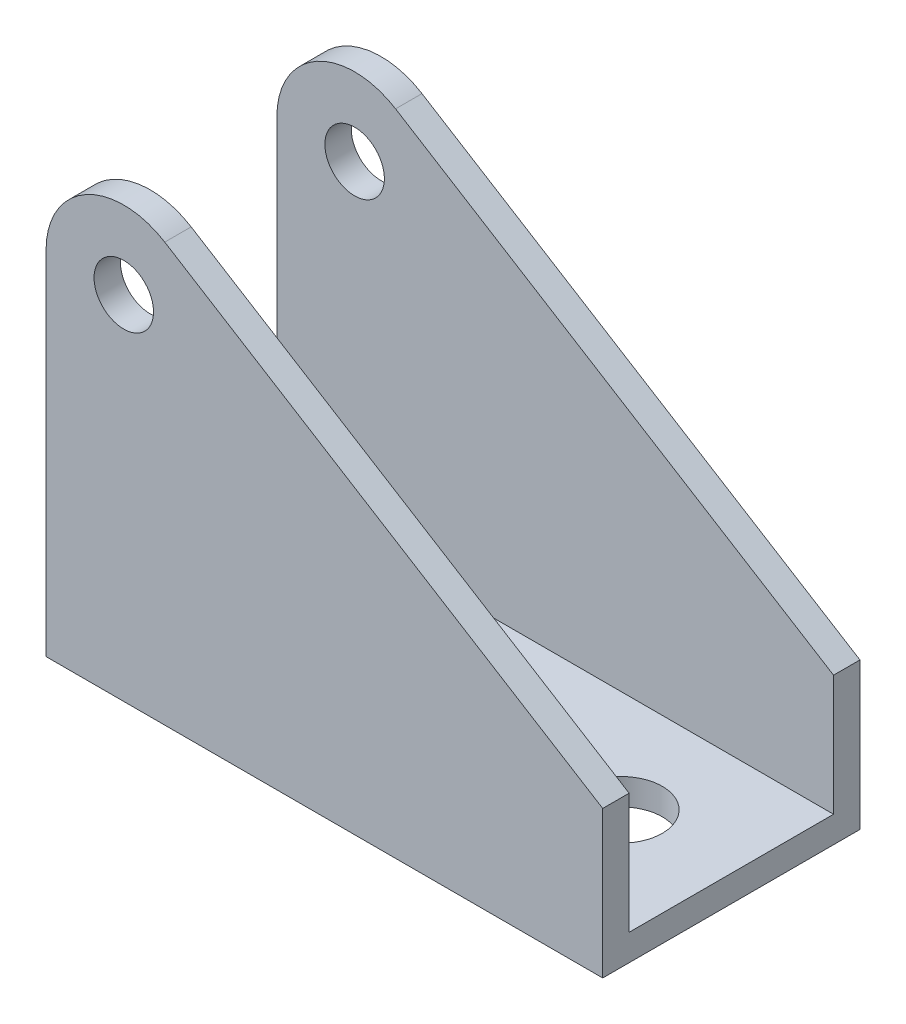
ISO-10303-21;
HEADER;
FILE_DESCRIPTION(('STEP AP214'),'2;1');
FILE_NAME('part.step','',(''),(''),'','','');
FILE_SCHEMA(('AUTOMOTIVE_DESIGN { 1 0 10303 214 1 1 1 1 }'));
ENDSEC;
DATA;
#1=APPLICATION_CONTEXT('core data for automotive mechanical design processes');
#2=APPLICATION_PROTOCOL_DEFINITION('international standard','automotive_design',2000,#1);
#3=PRODUCT_CONTEXT('',#1,'mechanical');
#4=PRODUCT('Part','Part','',(#3));
#5=PRODUCT_RELATED_PRODUCT_CATEGORY('part','',(#4));
#6=PRODUCT_DEFINITION_FORMATION('','',#4);
#7=PRODUCT_DEFINITION_CONTEXT('part definition',#1,'design');
#8=PRODUCT_DEFINITION('design','',#6,#7);
#9=PRODUCT_DEFINITION_SHAPE('','',#8);
#10=(LENGTH_UNIT() NAMED_UNIT(*) SI_UNIT(.MILLI.,.METRE.));
#11=(NAMED_UNIT(*) PLANE_ANGLE_UNIT() SI_UNIT($,.RADIAN.));
#12=(NAMED_UNIT(*) SI_UNIT($,.STERADIAN.) SOLID_ANGLE_UNIT());
#13=UNCERTAINTY_MEASURE_WITH_UNIT(LENGTH_MEASURE(1.E-05),#10,'distance_accuracy_value','');
#14=(GEOMETRIC_REPRESENTATION_CONTEXT(3) GLOBAL_UNCERTAINTY_ASSIGNED_CONTEXT((#13)) GLOBAL_UNIT_ASSIGNED_CONTEXT((#10,
#11,#12)) REPRESENTATION_CONTEXT('',''));
#15=CARTESIAN_POINT('',(0.,0.,0.));
#16=DIRECTION('',(0.,0.,1.));
#17=DIRECTION('',(1.,0.,0.));
#18=AXIS2_PLACEMENT_3D('',#15,#16,#17);
#19=CARTESIAN_POINT('',(0.,2.75,0.));
#20=DIRECTION('',(0.,1.,0.));
#21=DIRECTION('',(0.,0.,1.));
#22=AXIS2_PLACEMENT_3D('',#19,#20,#21);
#23=PLANE('',#22);
#24=CARTESIAN_POINT('',(0.,2.75,0.));
#25=DIRECTION('',(0.,1.,0.));
#26=DIRECTION('',(0.,0.,1.));
#27=AXIS2_PLACEMENT_3D('',#24,#25,#26);
#28=CIRCLE('',#27,4.25);
#29=CARTESIAN_POINT('',(0.,2.75,4.25));
#30=VERTEX_POINT('',#29);
#31=EDGE_CURVE('E226',#30,#30,#28,.T.);
#32=ORIENTED_EDGE('',*,*,#31,.F.);
#33=EDGE_LOOP('',(#32));
#34=FACE_BOUND('',#33,.T.);
#35=DIRECTION('',(0.,0.,-1.));
#36=VECTOR('',#35,1.);
#37=CARTESIAN_POINT('',(11.45,2.75,0.));
#38=LINE('',#37,#36);
#39=CARTESIAN_POINT('',(11.45,2.75,10.65));
#40=VERTEX_POINT('',#39);
#41=CARTESIAN_POINT('',(11.45,2.75,-10.65));
#42=VERTEX_POINT('',#41);
#43=EDGE_CURVE('E221',#40,#42,#38,.T.);
#44=ORIENTED_EDGE('',*,*,#43,.T.);
#45=DIRECTION('',(-1.,0.,0.));
#46=VECTOR('',#45,1.);
#47=CARTESIAN_POINT('',(0.,2.75,-10.65));
#48=LINE('',#47,#46);
#49=CARTESIAN_POINT('',(-46.55,2.75,-10.65));
#50=VERTEX_POINT('',#49);
#51=EDGE_CURVE('E179',#42,#50,#48,.T.);
#52=ORIENTED_EDGE('',*,*,#51,.T.);
#53=DIRECTION('',(0.,0.,-1.));
#54=VECTOR('',#53,1.);
#55=CARTESIAN_POINT('',(-46.55,2.75,0.));
#56=LINE('',#55,#54);
#57=CARTESIAN_POINT('',(-46.55,2.75,-4.25000000000001));
#58=VERTEX_POINT('',#57);
#59=EDGE_CURVE('E145',#58,#50,#56,.T.);
#60=ORIENTED_EDGE('',*,*,#59,.F.);
#61=DIRECTION('',(-1.,0.,0.));
#62=VECTOR('',#61,1.);
#63=CARTESIAN_POINT('',(0.,2.75,-4.25000000000001));
#64=LINE('',#63,#62);
#65=CARTESIAN_POINT('',(-36.5,2.75,-4.25000000000001));
#66=VERTEX_POINT('',#65);
#67=EDGE_CURVE('E224',#66,#58,#64,.T.);
#68=ORIENTED_EDGE('',*,*,#67,.F.);
#69=CARTESIAN_POINT('',(-36.5,2.75,0.));
#70=DIRECTION('',(0.,1.,0.));
#71=DIRECTION('',(0.,0.,1.));
#72=AXIS2_PLACEMENT_3D('',#69,#70,#71);
#73=CIRCLE('',#72,4.25000000000001);
#74=CARTESIAN_POINT('',(-36.5,2.75,4.25000000000001));
#75=VERTEX_POINT('',#74);
#76=EDGE_CURVE('E213',#75,#66,#73,.T.);
#77=ORIENTED_EDGE('',*,*,#76,.F.);
#78=DIRECTION('',(-1.,0.,0.));
#79=VECTOR('',#78,1.);
#80=CARTESIAN_POINT('',(0.,2.75,4.25000000000001));
#81=LINE('',#80,#79);
#82=CARTESIAN_POINT('',(-46.55,2.75,4.25000000000001));
#83=VERTEX_POINT('',#82);
#84=EDGE_CURVE('E215',#75,#83,#81,.T.);
#85=ORIENTED_EDGE('',*,*,#84,.T.);
#86=CARTESIAN_POINT('',(-46.55,2.75,10.65));
#87=VERTEX_POINT('',#86);
#88=EDGE_CURVE('E219',#87,#83,#56,.T.);
#89=ORIENTED_EDGE('',*,*,#88,.F.);
#90=DIRECTION('',(-1.,0.,0.));
#91=VECTOR('',#90,1.);
#92=CARTESIAN_POINT('',(0.,2.75,10.65));
#93=LINE('',#92,#91);
#94=EDGE_CURVE('E206',#40,#87,#93,.T.);
#95=ORIENTED_EDGE('',*,*,#94,.F.);
#96=EDGE_LOOP('',(#44,#52,#60,#68,#77,#85,#89,#95));
#97=FACE_BOUND('',#96,.T.);
#98=ADVANCED_FACE('F33',(#34,#97),#23,.T.);
#99=CARTESIAN_POINT('',(-36.5,2.75,0.));
#100=DIRECTION('',(0.,-1.,0.));
#101=DIRECTION('',(0.,0.,-1.));
#102=AXIS2_PLACEMENT_3D('',#99,#100,#101);
#103=CYLINDRICAL_SURFACE('',#102,4.25000000000001);
#104=CARTESIAN_POINT('',(-36.5,0.,0.));
#105=DIRECTION('',(0.,1.,0.));
#106=DIRECTION('',(0.,0.,1.));
#107=AXIS2_PLACEMENT_3D('',#104,#105,#106);
#108=CIRCLE('',#107,4.25000000000001);
#109=CARTESIAN_POINT('',(-36.5,0.,4.25000000000001));
#110=VERTEX_POINT('',#109);
#111=CARTESIAN_POINT('',(-36.5,0.,-4.25000000000001));
#112=VERTEX_POINT('',#111);
#113=EDGE_CURVE('E212',#110,#112,#108,.T.);
#114=ORIENTED_EDGE('',*,*,#113,.F.);
#115=DIRECTION('',(0.,-1.,0.));
#116=VECTOR('',#115,1.);
#117=CARTESIAN_POINT('',(-36.5,2.75,4.25000000000001));
#118=LINE('',#117,#116);
#119=EDGE_CURVE('E11',#75,#110,#118,.T.);
#120=ORIENTED_EDGE('',*,*,#119,.F.);
#121=ORIENTED_EDGE('',*,*,#76,.T.);
#122=DIRECTION('',(0.,-1.,0.));
#123=VECTOR('',#122,1.);
#124=CARTESIAN_POINT('',(-36.5,2.75,-4.25000000000001));
#125=LINE('',#124,#123);
#126=EDGE_CURVE('E57',#66,#112,#125,.T.);
#127=ORIENTED_EDGE('',*,*,#126,.T.);
#128=EDGE_LOOP('',(#114,#120,#121,#127));
#129=FACE_BOUND('',#128,.T.);
#130=ADVANCED_FACE('F35',(#129),#103,.F.);
#131=CARTESIAN_POINT('',(0.,2.75,4.25000000000001));
#132=DIRECTION('',(0.,0.,1.));
#133=DIRECTION('',(1.,0.,0.));
#134=AXIS2_PLACEMENT_3D('',#131,#132,#133);
#135=PLANE('',#134);
#136=DIRECTION('',(-1.,0.,0.));
#137=VECTOR('',#136,1.);
#138=CARTESIAN_POINT('',(0.,0.,4.25000000000001));
#139=LINE('',#138,#137);
#140=CARTESIAN_POINT('',(-46.55,0.,4.25000000000001));
#141=VERTEX_POINT('',#140);
#142=EDGE_CURVE('E230',#110,#141,#139,.T.);
#143=ORIENTED_EDGE('',*,*,#142,.T.);
#144=DIRECTION('',(0.,-1.,0.));
#145=VECTOR('',#144,1.);
#146=CARTESIAN_POINT('',(-46.55,2.75,4.25000000000001));
#147=LINE('',#146,#145);
#148=EDGE_CURVE('E41',#83,#141,#147,.T.);
#149=ORIENTED_EDGE('',*,*,#148,.F.);
#150=ORIENTED_EDGE('',*,*,#84,.F.);
#151=ORIENTED_EDGE('',*,*,#119,.T.);
#152=EDGE_LOOP('',(#143,#149,#150,#151));
#153=FACE_BOUND('',#152,.T.);
#154=ADVANCED_FACE('F267',(#153),#135,.F.);
#155=CARTESIAN_POINT('',(-46.55,2.75,0.));
#156=DIRECTION('',(-1.,0.,0.));
#157=DIRECTION('',(0.,0.,1.));
#158=AXIS2_PLACEMENT_3D('',#155,#156,#157);
#159=PLANE('',#158);
#160=ORIENTED_EDGE('',*,*,#148,.T.);
#161=DIRECTION('',(0.,0.,-1.));
#162=VECTOR('',#161,1.);
#163=CARTESIAN_POINT('',(-46.55,0.,0.));
#164=LINE('',#163,#162);
#165=CARTESIAN_POINT('',(-46.55,0.,13.4));
#166=VERTEX_POINT('',#165);
#167=EDGE_CURVE('E233',#166,#141,#164,.T.);
#168=ORIENTED_EDGE('',*,*,#167,.F.);
#169=DIRECTION('',(0.,-1.,0.));
#170=VECTOR('',#169,1.);
#171=CARTESIAN_POINT('',(-46.55,2.75,13.4));
#172=LINE('',#171,#170);
#173=CARTESIAN_POINT('',(-46.55,36.7,13.4));
#174=VERTEX_POINT('',#173);
#175=EDGE_CURVE('E259',#174,#166,#172,.T.);
#176=ORIENTED_EDGE('',*,*,#175,.F.);
#177=DIRECTION('',(0.,0.,1.));
#178=VECTOR('',#177,1.);
#179=CARTESIAN_POINT('',(-46.55,36.7,10.65));
#180=LINE('',#179,#178);
#181=CARTESIAN_POINT('',(-46.55,36.7,10.65));
#182=VERTEX_POINT('',#181);
#183=EDGE_CURVE('E207',#182,#174,#180,.T.);
#184=ORIENTED_EDGE('',*,*,#183,.F.);
#185=DIRECTION('',(0.,-1.,0.));
#186=VECTOR('',#185,1.);
#187=CARTESIAN_POINT('',(-46.55,2.75000000000001,10.65));
#188=LINE('',#187,#186);
#189=EDGE_CURVE('E48',#182,#87,#188,.T.);
#190=ORIENTED_EDGE('',*,*,#189,.T.);
#191=ORIENTED_EDGE('',*,*,#88,.T.);
#192=EDGE_LOOP('',(#160,#168,#176,#184,#190,#191));
#193=FACE_BOUND('',#192,.T.);
#194=ADVANCED_FACE('F263',(#193),#159,.T.);
#195=CARTESIAN_POINT('',(0.,2.75,13.4));
#196=DIRECTION('',(0.,0.,-1.));
#197=DIRECTION('',(-1.,0.,0.));
#198=AXIS2_PLACEMENT_3D('',#195,#196,#197);
#199=PLANE('',#198);
#200=DIRECTION('',(1.,0.,0.));
#201=VECTOR('',#200,1.);
#202=CARTESIAN_POINT('',(0.,0.,13.4));
#203=LINE('',#202,#201);
#204=CARTESIAN_POINT('',(11.45,0.,13.4));
#205=VERTEX_POINT('',#204);
#206=EDGE_CURVE('E235',#166,#205,#203,.T.);
#207=ORIENTED_EDGE('',*,*,#206,.T.);
#208=DIRECTION('',(0.,-1.,0.));
#209=VECTOR('',#208,1.);
#210=CARTESIAN_POINT('',(11.45,2.75,13.4));
#211=LINE('',#210,#209);
#212=CARTESIAN_POINT('',(11.45,15.3,13.4));
#213=VERTEX_POINT('',#212);
#214=EDGE_CURVE('E256',#213,#205,#211,.T.);
#215=ORIENTED_EDGE('',*,*,#214,.F.);
#216=DIRECTION('',(-0.849965225718267,0.52683879419581,0.));
#217=VECTOR('',#216,1.);
#218=CARTESIAN_POINT('',(8.79787478310156,16.9438819013405,13.4));
#219=LINE('',#218,#217);
#220=CARTESIAN_POINT('',(-34.182605767014,43.584718328318,13.4));
#221=VERTEX_POINT('',#220);
#222=EDGE_CURVE('E186',#213,#221,#219,.T.);
#223=ORIENTED_EDGE('',*,*,#222,.T.);
#224=CARTESIAN_POINT('',(-38.45,36.7,13.4));
#225=DIRECTION('',(0.,0.,-1.));
#226=DIRECTION('',(-1.,0.,0.));
#227=AXIS2_PLACEMENT_3D('',#224,#225,#226);
#228=CIRCLE('',#227,8.1);
#229=EDGE_CURVE('E193',#174,#221,#228,.T.);
#230=ORIENTED_EDGE('',*,*,#229,.F.);
#231=ORIENTED_EDGE('',*,*,#175,.T.);
#232=EDGE_LOOP('',(#207,#215,#223,#230,#231));
#233=FACE_BOUND('',#232,.T.);
#234=CARTESIAN_POINT('',(-38.45,36.7,13.4));
#235=DIRECTION('',(0.,0.,-1.));
#236=DIRECTION('',(-1.,0.,0.));
#237=AXIS2_PLACEMENT_3D('',#234,#235,#236);
#238=CIRCLE('',#237,3.09999999999999);
#239=CARTESIAN_POINT('',(-41.55,36.7,13.4));
#240=VERTEX_POINT('',#239);
#241=EDGE_CURVE('E182',#240,#240,#238,.T.);
#242=ORIENTED_EDGE('',*,*,#241,.T.);
#243=EDGE_LOOP('',(#242));
#244=FACE_BOUND('',#243,.T.);
#245=ADVANCED_FACE('F306',(#233,#244),#199,.F.);
#246=CARTESIAN_POINT('',(11.45,2.75,0.));
#247=DIRECTION('',(-1.,0.,0.));
#248=DIRECTION('',(0.,0.,1.));
#249=AXIS2_PLACEMENT_3D('',#246,#247,#248);
#250=PLANE('',#249);
#251=DIRECTION('',(0.,-1.,0.));
#252=VECTOR('',#251,1.);
#253=CARTESIAN_POINT('',(11.45,2.75,-13.4));
#254=LINE('',#253,#252);
#255=CARTESIAN_POINT('',(11.45,15.3,-13.4));
#256=VERTEX_POINT('',#255);
#257=CARTESIAN_POINT('',(11.45,0.,-13.4));
#258=VERTEX_POINT('',#257);
#259=EDGE_CURVE('E253',#256,#258,#254,.T.);
#260=ORIENTED_EDGE('',*,*,#259,.F.);
#261=DIRECTION('',(0.,0.,-1.));
#262=VECTOR('',#261,1.);
#263=CARTESIAN_POINT('',(11.45,15.3,-10.65));
#264=LINE('',#263,#262);
#265=CARTESIAN_POINT('',(11.45,15.3,-10.65));
#266=VERTEX_POINT('',#265);
#267=EDGE_CURVE('E176',#266,#256,#264,.T.);
#268=ORIENTED_EDGE('',*,*,#267,.F.);
#269=DIRECTION('',(0.,-1.,0.));
#270=VECTOR('',#269,1.);
#271=CARTESIAN_POINT('',(11.45,2.75,-10.65));
#272=LINE('',#271,#270);
#273=EDGE_CURVE('E158',#266,#42,#272,.T.);
#274=ORIENTED_EDGE('',*,*,#273,.T.);
#275=ORIENTED_EDGE('',*,*,#43,.F.);
#276=DIRECTION('',(0.,1.,0.));
#277=VECTOR('',#276,1.);
#278=CARTESIAN_POINT('',(11.45,2.75,10.65));
#279=LINE('',#278,#277);
#280=CARTESIAN_POINT('',(11.45,15.3,10.65));
#281=VERTEX_POINT('',#280);
#282=EDGE_CURVE('E196',#40,#281,#279,.T.);
#283=ORIENTED_EDGE('',*,*,#282,.T.);
#284=DIRECTION('',(0.,0.,1.));
#285=VECTOR('',#284,1.);
#286=CARTESIAN_POINT('',(11.45,15.3,10.65));
#287=LINE('',#286,#285);
#288=EDGE_CURVE('E203',#281,#213,#287,.T.);
#289=ORIENTED_EDGE('',*,*,#288,.T.);
#290=ORIENTED_EDGE('',*,*,#214,.T.);
#291=DIRECTION('',(0.,0.,-1.));
#292=VECTOR('',#291,1.);
#293=CARTESIAN_POINT('',(11.45,0.,0.));
#294=LINE('',#293,#292);
#295=EDGE_CURVE('E238',#205,#258,#294,.T.);
#296=ORIENTED_EDGE('',*,*,#295,.T.);
#297=EDGE_LOOP('',(#260,#268,#274,#275,#283,#289,#290,#296));
#298=FACE_BOUND('',#297,.T.);
#299=ADVANCED_FACE('F302',(#298),#250,.F.);
#300=CARTESIAN_POINT('',(0.,2.75,-13.4));
#301=DIRECTION('',(0.,0.,-1.));
#302=DIRECTION('',(-1.,0.,0.));
#303=AXIS2_PLACEMENT_3D('',#300,#301,#302);
#304=PLANE('',#303);
#305=DIRECTION('',(1.,0.,0.));
#306=VECTOR('',#305,1.);
#307=CARTESIAN_POINT('',(0.,0.,-13.4));
#308=LINE('',#307,#306);
#309=CARTESIAN_POINT('',(-46.55,0.,-13.4));
#310=VERTEX_POINT('',#309);
#311=EDGE_CURVE('E240',#310,#258,#308,.T.);
#312=ORIENTED_EDGE('',*,*,#311,.F.);
#313=DIRECTION('',(0.,-1.,0.));
#314=VECTOR('',#313,1.);
#315=CARTESIAN_POINT('',(-46.55,2.75,-13.4));
#316=LINE('',#315,#314);
#317=CARTESIAN_POINT('',(-46.55,36.7,-13.4));
#318=VERTEX_POINT('',#317);
#319=EDGE_CURVE('E251',#318,#310,#316,.T.);
#320=ORIENTED_EDGE('',*,*,#319,.F.);
#321=CARTESIAN_POINT('',(-38.45,36.7,-13.4));
#322=DIRECTION('',(0.,0.,-1.));
#323=DIRECTION('',(-1.,0.,0.));
#324=AXIS2_PLACEMENT_3D('',#321,#322,#323);
#325=CIRCLE('',#324,8.1);
#326=CARTESIAN_POINT('',(-34.1826057670139,43.584718328318,-13.4));
#327=VERTEX_POINT('',#326);
#328=EDGE_CURVE('E156',#318,#327,#325,.T.);
#329=ORIENTED_EDGE('',*,*,#328,.T.);
#330=DIRECTION('',(0.849965225718267,-0.52683879419581,0.));
#331=VECTOR('',#330,1.);
#332=CARTESIAN_POINT('',(8.79787478310156,16.9438819013405,-13.4));
#333=LINE('',#332,#331);
#334=EDGE_CURVE('E150',#327,#256,#333,.T.);
#335=ORIENTED_EDGE('',*,*,#334,.T.);
#336=ORIENTED_EDGE('',*,*,#259,.T.);
#337=EDGE_LOOP('',(#312,#320,#329,#335,#336));
#338=FACE_BOUND('',#337,.T.);
#339=CARTESIAN_POINT('',(-38.45,36.7,-13.4));
#340=DIRECTION('',(0.,0.,-1.));
#341=DIRECTION('',(-1.,0.,0.));
#342=AXIS2_PLACEMENT_3D('',#339,#340,#341);
#343=CIRCLE('',#342,3.09999999999999);
#344=CARTESIAN_POINT('',(-41.55,36.7,-13.4));
#345=VERTEX_POINT('',#344);
#346=EDGE_CURVE('E356',#345,#345,#343,.T.);
#347=ORIENTED_EDGE('',*,*,#346,.F.);
#348=EDGE_LOOP('',(#347));
#349=FACE_BOUND('',#348,.T.);
#350=ADVANCED_FACE('F299',(#338,#349),#304,.T.);
#351=ORIENTED_EDGE('',*,*,#319,.T.);
#352=CARTESIAN_POINT('',(-46.55,0.,-4.25000000000001));
#353=VERTEX_POINT('',#352);
#354=EDGE_CURVE('E236',#353,#310,#164,.T.);
#355=ORIENTED_EDGE('',*,*,#354,.F.);
#356=DIRECTION('',(0.,-1.,0.));
#357=VECTOR('',#356,1.);
#358=CARTESIAN_POINT('',(-46.55,2.75,-4.25000000000001));
#359=LINE('',#358,#357);
#360=EDGE_CURVE('E249',#58,#353,#359,.T.);
#361=ORIENTED_EDGE('',*,*,#360,.F.);
#362=ORIENTED_EDGE('',*,*,#59,.T.);
#363=DIRECTION('',(0.,1.,0.));
#364=VECTOR('',#363,1.);
#365=CARTESIAN_POINT('',(-46.55,2.75000000000001,-10.65));
#366=LINE('',#365,#364);
#367=CARTESIAN_POINT('',(-46.55,36.7,-10.65));
#368=VERTEX_POINT('',#367);
#369=EDGE_CURVE('E138',#50,#368,#366,.T.);
#370=ORIENTED_EDGE('',*,*,#369,.T.);
#371=DIRECTION('',(0.,0.,-1.));
#372=VECTOR('',#371,1.);
#373=CARTESIAN_POINT('',(-46.55,36.7,-10.65));
#374=LINE('',#373,#372);
#375=EDGE_CURVE('E142',#368,#318,#374,.T.);
#376=ORIENTED_EDGE('',*,*,#375,.T.);
#377=EDGE_LOOP('',(#351,#355,#361,#362,#370,#376));
#378=FACE_BOUND('',#377,.T.);
#379=ADVANCED_FACE('F141',(#378),#159,.T.);
#380=CARTESIAN_POINT('',(0.,2.75,-4.25000000000001));
#381=DIRECTION('',(0.,0.,1.));
#382=DIRECTION('',(1.,0.,0.));
#383=AXIS2_PLACEMENT_3D('',#380,#381,#382);
#384=PLANE('',#383);
#385=DIRECTION('',(-1.,0.,0.));
#386=VECTOR('',#385,1.);
#387=CARTESIAN_POINT('',(0.,0.,-4.25000000000001));
#388=LINE('',#387,#386);
#389=EDGE_CURVE('E243',#112,#353,#388,.T.);
#390=ORIENTED_EDGE('',*,*,#389,.F.);
#391=ORIENTED_EDGE('',*,*,#126,.F.);
#392=ORIENTED_EDGE('',*,*,#67,.T.);
#393=ORIENTED_EDGE('',*,*,#360,.T.);
#394=EDGE_LOOP('',(#390,#391,#392,#393));
#395=FACE_BOUND('',#394,.T.);
#396=ADVANCED_FACE('F293',(#395),#384,.T.);
#397=CARTESIAN_POINT('',(0.,2.75,0.));
#398=DIRECTION('',(0.,-1.,0.));
#399=DIRECTION('',(0.,0.,-1.));
#400=AXIS2_PLACEMENT_3D('',#397,#398,#399);
#401=CYLINDRICAL_SURFACE('',#400,4.25);
#402=ORIENTED_EDGE('',*,*,#31,.T.);
#403=EDGE_LOOP('',(#402));
#404=FACE_BOUND('',#403,.T.);
#405=CARTESIAN_POINT('',(0.,0.,0.));
#406=DIRECTION('',(0.,1.,0.));
#407=DIRECTION('',(0.,0.,1.));
#408=AXIS2_PLACEMENT_3D('',#405,#406,#407);
#409=CIRCLE('',#408,4.25);
#410=CARTESIAN_POINT('',(0.,0.,4.25));
#411=VERTEX_POINT('',#410);
#412=EDGE_CURVE('E216',#411,#411,#409,.T.);
#413=ORIENTED_EDGE('',*,*,#412,.F.);
#414=EDGE_LOOP('',(#413));
#415=FACE_BOUND('',#414,.T.);
#416=ADVANCED_FACE('F290',(#404,#415),#401,.F.);
#417=CARTESIAN_POINT('',(0.,0.,0.));
#418=DIRECTION('',(0.,1.,0.));
#419=DIRECTION('',(0.,0.,1.));
#420=AXIS2_PLACEMENT_3D('',#417,#418,#419);
#421=PLANE('',#420);
#422=ORIENTED_EDGE('',*,*,#311,.T.);
#423=ORIENTED_EDGE('',*,*,#295,.F.);
#424=ORIENTED_EDGE('',*,*,#206,.F.);
#425=ORIENTED_EDGE('',*,*,#167,.T.);
#426=ORIENTED_EDGE('',*,*,#142,.F.);
#427=ORIENTED_EDGE('',*,*,#113,.T.);
#428=ORIENTED_EDGE('',*,*,#389,.T.);
#429=ORIENTED_EDGE('',*,*,#354,.T.);
#430=EDGE_LOOP('',(#422,#423,#424,#425,#426,#427,#428,#429));
#431=FACE_BOUND('',#430,.T.);
#432=ORIENTED_EDGE('',*,*,#412,.T.);
#433=EDGE_LOOP('',(#432));
#434=FACE_BOUND('',#433,.T.);
#435=ADVANCED_FACE('F269',(#431,#434),#421,.F.);
#436=CARTESIAN_POINT('',(-38.45,36.7,10.65));
#437=DIRECTION('',(0.,0.,-1.));
#438=DIRECTION('',(-1.,0.,0.));
#439=AXIS2_PLACEMENT_3D('',#436,#437,#438);
#440=PLANE('',#439);
#441=ORIENTED_EDGE('',*,*,#282,.F.);
#442=ORIENTED_EDGE('',*,*,#94,.T.);
#443=ORIENTED_EDGE('',*,*,#189,.F.);
#444=CARTESIAN_POINT('',(-38.45,36.7,10.65));
#445=DIRECTION('',(0.,0.,-1.));
#446=DIRECTION('',(-1.,0.,0.));
#447=AXIS2_PLACEMENT_3D('',#444,#445,#446);
#448=CIRCLE('',#447,8.1);
#449=CARTESIAN_POINT('',(-34.182605767014,43.584718328318,10.65));
#450=VERTEX_POINT('',#449);
#451=EDGE_CURVE('E192',#182,#450,#448,.T.);
#452=ORIENTED_EDGE('',*,*,#451,.T.);
#453=DIRECTION('',(-0.849965225718267,0.52683879419581,0.));
#454=VECTOR('',#453,1.);
#455=CARTESIAN_POINT('',(8.79787478310156,16.9438819013405,10.65));
#456=LINE('',#455,#454);
#457=EDGE_CURVE('E189',#281,#450,#456,.T.);
#458=ORIENTED_EDGE('',*,*,#457,.F.);
#459=EDGE_LOOP('',(#441,#442,#443,#452,#458));
#460=FACE_BOUND('',#459,.T.);
#461=CARTESIAN_POINT('',(-38.45,36.7,10.65));
#462=DIRECTION('',(0.,0.,-1.));
#463=DIRECTION('',(-1.,0.,0.));
#464=AXIS2_PLACEMENT_3D('',#461,#462,#463);
#465=CIRCLE('',#464,3.09999999999999);
#466=CARTESIAN_POINT('',(-41.55,36.7,10.65));
#467=VERTEX_POINT('',#466);
#468=EDGE_CURVE('E183',#467,#467,#465,.T.);
#469=ORIENTED_EDGE('',*,*,#468,.F.);
#470=EDGE_LOOP('',(#469));
#471=FACE_BOUND('',#470,.T.);
#472=ADVANCED_FACE('F289',(#460,#471),#440,.T.);
#473=CARTESIAN_POINT('',(8.79787478310156,16.9438819013405,10.65));
#474=DIRECTION('',(0.52683879419581,0.849965225718267,0.));
#475=DIRECTION('',(-0.849965225718267,0.52683879419581,0.));
#476=AXIS2_PLACEMENT_3D('',#473,#474,#475);
#477=PLANE('',#476);
#478=ORIENTED_EDGE('',*,*,#222,.F.);
#479=ORIENTED_EDGE('',*,*,#288,.F.);
#480=ORIENTED_EDGE('',*,*,#457,.T.);
#481=DIRECTION('',(0.,0.,1.));
#482=VECTOR('',#481,1.);
#483=CARTESIAN_POINT('',(-34.182605767014,43.584718328318,10.65));
#484=LINE('',#483,#482);
#485=EDGE_CURVE('E198',#450,#221,#484,.T.);
#486=ORIENTED_EDGE('',*,*,#485,.T.);
#487=EDGE_LOOP('',(#478,#479,#480,#486));
#488=FACE_BOUND('',#487,.T.);
#489=ADVANCED_FACE('F285',(#488),#477,.T.);
#490=CARTESIAN_POINT('',(-38.45,36.7,10.65));
#491=DIRECTION('',(0.,0.,1.));
#492=DIRECTION('',(1.,0.,0.));
#493=AXIS2_PLACEMENT_3D('',#490,#491,#492);
#494=CYLINDRICAL_SURFACE('',#493,8.1);
#495=ORIENTED_EDGE('',*,*,#229,.T.);
#496=ORIENTED_EDGE('',*,*,#485,.F.);
#497=ORIENTED_EDGE('',*,*,#451,.F.);
#498=ORIENTED_EDGE('',*,*,#183,.T.);
#499=EDGE_LOOP('',(#495,#496,#497,#498));
#500=FACE_BOUND('',#499,.T.);
#501=ADVANCED_FACE('F319',(#500),#494,.T.);
#502=CARTESIAN_POINT('',(-38.45,36.7,10.65));
#503=DIRECTION('',(0.,0.,1.));
#504=DIRECTION('',(1.,0.,0.));
#505=AXIS2_PLACEMENT_3D('',#502,#503,#504);
#506=CYLINDRICAL_SURFACE('',#505,3.09999999999999);
#507=ORIENTED_EDGE('',*,*,#468,.T.);
#508=EDGE_LOOP('',(#507));
#509=FACE_BOUND('',#508,.T.);
#510=ORIENTED_EDGE('',*,*,#241,.F.);
#511=EDGE_LOOP('',(#510));
#512=FACE_BOUND('',#511,.T.);
#513=ADVANCED_FACE('F316',(#509,#512),#506,.F.);
#514=CARTESIAN_POINT('',(8.79787478310156,16.9438819013405,-10.65));
#515=DIRECTION('',(0.52683879419581,0.849965225718267,0.));
#516=DIRECTION('',(-0.849965225718267,0.52683879419581,0.));
#517=AXIS2_PLACEMENT_3D('',#514,#515,#516);
#518=PLANE('',#517);
#519=ORIENTED_EDGE('',*,*,#334,.F.);
#520=DIRECTION('',(0.,0.,-1.));
#521=VECTOR('',#520,1.);
#522=CARTESIAN_POINT('',(-34.1826057670139,43.584718328318,-10.65));
#523=LINE('',#522,#521);
#524=CARTESIAN_POINT('',(-34.1826057670139,43.584718328318,-10.65));
#525=VERTEX_POINT('',#524);
#526=EDGE_CURVE('E157',#525,#327,#523,.T.);
#527=ORIENTED_EDGE('',*,*,#526,.F.);
#528=DIRECTION('',(0.849965225718267,-0.52683879419581,0.));
#529=VECTOR('',#528,1.);
#530=CARTESIAN_POINT('',(8.79787478310156,16.9438819013405,-10.65));
#531=LINE('',#530,#529);
#532=EDGE_CURVE('E165',#525,#266,#531,.T.);
#533=ORIENTED_EDGE('',*,*,#532,.T.);
#534=ORIENTED_EDGE('',*,*,#267,.T.);
#535=EDGE_LOOP('',(#519,#527,#533,#534));
#536=FACE_BOUND('',#535,.T.);
#537=ADVANCED_FACE('F318',(#536),#518,.T.);
#538=CARTESIAN_POINT('',(-38.45,36.7,-10.65));
#539=DIRECTION('',(0.,0.,-1.));
#540=DIRECTION('',(-1.,0.,0.));
#541=AXIS2_PLACEMENT_3D('',#538,#539,#540);
#542=CYLINDRICAL_SURFACE('',#541,8.1);
#543=ORIENTED_EDGE('',*,*,#328,.F.);
#544=ORIENTED_EDGE('',*,*,#375,.F.);
#545=CARTESIAN_POINT('',(-38.45,36.7,-10.65));
#546=DIRECTION('',(0.,0.,-1.));
#547=DIRECTION('',(-1.,0.,0.));
#548=AXIS2_PLACEMENT_3D('',#545,#546,#547);
#549=CIRCLE('',#548,8.1);
#550=EDGE_CURVE('E149',#368,#525,#549,.T.);
#551=ORIENTED_EDGE('',*,*,#550,.T.);
#552=ORIENTED_EDGE('',*,*,#526,.T.);
#553=EDGE_LOOP('',(#543,#544,#551,#552));
#554=FACE_BOUND('',#553,.T.);
#555=ADVANCED_FACE('F154',(#554),#542,.T.);
#556=CARTESIAN_POINT('',(-38.45,36.7,-10.65));
#557=DIRECTION('',(0.,0.,-1.));
#558=DIRECTION('',(-1.,0.,0.));
#559=AXIS2_PLACEMENT_3D('',#556,#557,#558);
#560=PLANE('',#559);
#561=ORIENTED_EDGE('',*,*,#51,.F.);
#562=ORIENTED_EDGE('',*,*,#273,.F.);
#563=ORIENTED_EDGE('',*,*,#532,.F.);
#564=ORIENTED_EDGE('',*,*,#550,.F.);
#565=ORIENTED_EDGE('',*,*,#369,.F.);
#566=EDGE_LOOP('',(#561,#562,#563,#564,#565));
#567=FACE_BOUND('',#566,.T.);
#568=CARTESIAN_POINT('',(-38.45,36.7,-10.65));
#569=DIRECTION('',(0.,0.,-1.));
#570=DIRECTION('',(-1.,0.,0.));
#571=AXIS2_PLACEMENT_3D('',#568,#569,#570);
#572=CIRCLE('',#571,3.09999999999999);
#573=CARTESIAN_POINT('',(-41.55,36.7,-10.65));
#574=VERTEX_POINT('',#573);
#575=EDGE_CURVE('E173',#574,#574,#572,.T.);
#576=ORIENTED_EDGE('',*,*,#575,.T.);
#577=EDGE_LOOP('',(#576));
#578=FACE_BOUND('',#577,.T.);
#579=ADVANCED_FACE('F161',(#567,#578),#560,.F.);
#580=CARTESIAN_POINT('',(-38.45,36.7,-10.65));
#581=DIRECTION('',(0.,0.,-1.));
#582=DIRECTION('',(-1.,0.,0.));
#583=AXIS2_PLACEMENT_3D('',#580,#581,#582);
#584=CYLINDRICAL_SURFACE('',#583,3.09999999999999);
#585=ORIENTED_EDGE('',*,*,#575,.F.);
#586=EDGE_LOOP('',(#585));
#587=FACE_BOUND('',#586,.T.);
#588=ORIENTED_EDGE('',*,*,#346,.T.);
#589=EDGE_LOOP('',(#588));
#590=FACE_BOUND('',#589,.T.);
#591=ADVANCED_FACE('F362',(#587,#590),#584,.F.);
#592=CLOSED_SHELL('',(#98,#130,#154,#194,#245,#299,#350,#379,#396,#416,#435,#472,#489,#501,#513,
#537,#555,#579,#591));
#593=MANIFOLD_SOLID_BREP('B2',#592);
#594=ADVANCED_BREP_SHAPE_REPRESENTATION('',(#18,#593),#14);
#595=SHAPE_DEFINITION_REPRESENTATION(#9,#594);
ENDSEC;
END-ISO-10303-21;
